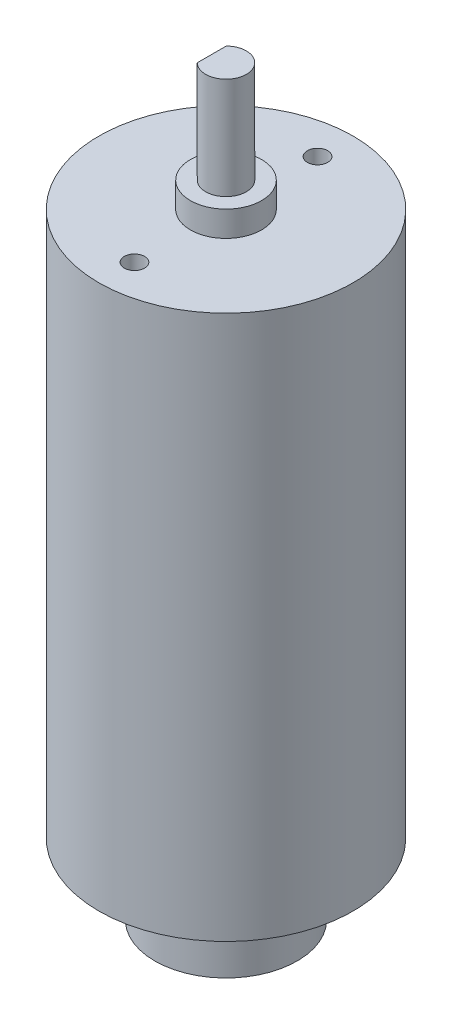
ISO-10303-21;
HEADER;
FILE_DESCRIPTION(('STEP AP214'),'2;1');
FILE_NAME('part.step','',(''),(''),'','','');
FILE_SCHEMA(('AUTOMOTIVE_DESIGN { 1 0 10303 214 1 1 1 1 }'));
ENDSEC;
DATA;
#1=APPLICATION_CONTEXT('core data for automotive mechanical design processes');
#2=APPLICATION_PROTOCOL_DEFINITION('international standard','automotive_design',2000,#1);
#3=PRODUCT_CONTEXT('',#1,'mechanical');
#4=PRODUCT('Part','Part','',(#3));
#5=PRODUCT_RELATED_PRODUCT_CATEGORY('part','',(#4));
#6=PRODUCT_DEFINITION_FORMATION('','',#4);
#7=PRODUCT_DEFINITION_CONTEXT('part definition',#1,'design');
#8=PRODUCT_DEFINITION('design','',#6,#7);
#9=PRODUCT_DEFINITION_SHAPE('','',#8);
#10=(LENGTH_UNIT() NAMED_UNIT(*) SI_UNIT(.MILLI.,.METRE.));
#11=(NAMED_UNIT(*) PLANE_ANGLE_UNIT() SI_UNIT($,.RADIAN.));
#12=(NAMED_UNIT(*) SI_UNIT($,.STERADIAN.) SOLID_ANGLE_UNIT());
#13=UNCERTAINTY_MEASURE_WITH_UNIT(LENGTH_MEASURE(1.E-05),#10,'distance_accuracy_value','');
#14=(GEOMETRIC_REPRESENTATION_CONTEXT(3) GLOBAL_UNCERTAINTY_ASSIGNED_CONTEXT((#13)) GLOBAL_UNIT_ASSIGNED_CONTEXT((#10,
#11,#12)) REPRESENTATION_CONTEXT('',''));
#15=CARTESIAN_POINT('',(0.,0.,0.));
#16=DIRECTION('',(0.,0.,1.));
#17=DIRECTION('',(1.,0.,0.));
#18=AXIS2_PLACEMENT_3D('',#15,#16,#17);
#19=CARTESIAN_POINT('',(0.,63.,0.));
#20=DIRECTION('',(0.,1.,0.));
#21=DIRECTION('',(0.,0.,1.));
#22=AXIS2_PLACEMENT_3D('',#19,#20,#21);
#23=PLANE('',#22);
#24=CARTESIAN_POINT('',(0.,63.,0.));
#25=DIRECTION('',(0.,1.,0.));
#26=DIRECTION('',(0.,0.,1.));
#27=AXIS2_PLACEMENT_3D('',#24,#25,#26);
#28=CIRCLE('',#27,3.5);
#29=CARTESIAN_POINT('',(0.,63.,3.5));
#30=VERTEX_POINT('',#29);
#31=EDGE_CURVE('E101',#30,#30,#28,.T.);
#32=ORIENTED_EDGE('',*,*,#31,.T.);
#33=EDGE_LOOP('',(#32));
#34=FACE_BOUND('',#33,.T.);
#35=CARTESIAN_POINT('',(0.,63.,0.));
#36=DIRECTION('',(0.,1.,0.));
#37=DIRECTION('',(0.,0.,1.));
#38=AXIS2_PLACEMENT_3D('',#35,#36,#37);
#39=CIRCLE('',#38,2.);
#40=CARTESIAN_POINT('',(0.,63.,2.));
#41=VERTEX_POINT('',#40);
#42=EDGE_CURVE('E89',#41,#41,#39,.T.);
#43=ORIENTED_EDGE('',*,*,#42,.F.);
#44=EDGE_LOOP('',(#43));
#45=FACE_BOUND('',#44,.T.);
#46=ADVANCED_FACE('F35',(#34,#45),#23,.T.);
#47=CARTESIAN_POINT('',(0.,7.,0.));
#48=DIRECTION('',(0.,-1.,0.));
#49=DIRECTION('',(0.,0.,-1.));
#50=AXIS2_PLACEMENT_3D('',#47,#48,#49);
#51=CYLINDRICAL_SURFACE('',#50,7.);
#52=CARTESIAN_POINT('',(0.,7.,0.));
#53=DIRECTION('',(0.,1.,0.));
#54=DIRECTION('',(0.,0.,1.));
#55=AXIS2_PLACEMENT_3D('',#52,#53,#54);
#56=CIRCLE('',#55,7.);
#57=CARTESIAN_POINT('',(0.,7.,7.));
#58=VERTEX_POINT('',#57);
#59=EDGE_CURVE('E107',#58,#58,#56,.T.);
#60=ORIENTED_EDGE('',*,*,#59,.F.);
#61=EDGE_LOOP('',(#60));
#62=FACE_BOUND('',#61,.T.);
#63=CARTESIAN_POINT('',(0.,0.,0.));
#64=DIRECTION('',(0.,1.,0.));
#65=DIRECTION('',(0.,0.,1.));
#66=AXIS2_PLACEMENT_3D('',#63,#64,#65);
#67=CIRCLE('',#66,7.);
#68=CARTESIAN_POINT('',(0.,0.,7.));
#69=VERTEX_POINT('',#68);
#70=EDGE_CURVE('E111',#69,#69,#67,.T.);
#71=ORIENTED_EDGE('',*,*,#70,.T.);
#72=EDGE_LOOP('',(#71));
#73=FACE_BOUND('',#72,.T.);
#74=ADVANCED_FACE('F37',(#62,#73),#51,.T.);
#75=CARTESIAN_POINT('',(0.,0.,0.));
#76=DIRECTION('',(0.,1.,0.));
#77=DIRECTION('',(0.,0.,1.));
#78=AXIS2_PLACEMENT_3D('',#75,#76,#77);
#79=PLANE('',#78);
#80=ORIENTED_EDGE('',*,*,#70,.F.);
#81=EDGE_LOOP('',(#80));
#82=FACE_BOUND('',#81,.T.);
#83=ADVANCED_FACE('F119',(#82),#79,.F.);
#84=CARTESIAN_POINT('',(0.,60.5,0.));
#85=DIRECTION('',(0.,-1.,0.));
#86=DIRECTION('',(0.,0.,-1.));
#87=AXIS2_PLACEMENT_3D('',#84,#85,#86);
#88=CYLINDRICAL_SURFACE('',#87,12.5);
#89=CARTESIAN_POINT('',(0.,60.5,0.));
#90=DIRECTION('',(0.,1.,0.));
#91=DIRECTION('',(0.,0.,1.));
#92=AXIS2_PLACEMENT_3D('',#89,#90,#91);
#93=CIRCLE('',#92,12.5);
#94=CARTESIAN_POINT('',(0.,60.5,-12.5));
#95=VERTEX_POINT('',#94);
#96=EDGE_CURVE('E108',#95,#95,#93,.T.);
#97=CARTESIAN_POINT('',(0.,7.,0.));
#98=DIRECTION('',(0.,1.,0.));
#99=DIRECTION('',(0.,0.,1.));
#100=AXIS2_PLACEMENT_3D('',#97,#98,#99);
#101=CIRCLE('',#100,12.5);
#102=CARTESIAN_POINT('',(0.,7.00000000000001,-12.5));
#103=VERTEX_POINT('',#102);
#104=EDGE_CURVE('E104',#103,#103,#101,.T.);
#105=CARTESIAN_POINT('',(0.,60.5,-12.5));
#106=CARTESIAN_POINT('',(0.,59.9427083333333,-12.5));
#107=CARTESIAN_POINT('',(0.,59.3854166666667,-12.5));
#108=CARTESIAN_POINT('',(0.,58.2708333333333,-12.5));
#109=CARTESIAN_POINT('',(0.,57.7135416666667,-12.5));
#110=CARTESIAN_POINT('',(0.,56.5989583333333,-12.5));
#111=CARTESIAN_POINT('',(0.,56.0416666666667,-12.5));
#112=CARTESIAN_POINT('',(0.,54.9270833333333,-12.5));
#113=CARTESIAN_POINT('',(0.,54.3697916666667,-12.5));
#114=CARTESIAN_POINT('',(0.,53.2552083333333,-12.5));
#115=CARTESIAN_POINT('',(0.,52.6979166666667,-12.5));
#116=CARTESIAN_POINT('',(0.,51.5833333333333,-12.5));
#117=CARTESIAN_POINT('',(0.,51.0260416666667,-12.5));
#118=CARTESIAN_POINT('',(0.,49.9114583333333,-12.5));
#119=CARTESIAN_POINT('',(0.,49.3541666666667,-12.5));
#120=CARTESIAN_POINT('',(0.,48.2395833333333,-12.5));
#121=CARTESIAN_POINT('',(0.,47.6822916666667,-12.5));
#122=CARTESIAN_POINT('',(0.,46.5677083333333,-12.5));
#123=CARTESIAN_POINT('',(0.,46.0104166666667,-12.5));
#124=CARTESIAN_POINT('',(0.,44.8958333333333,-12.5));
#125=CARTESIAN_POINT('',(0.,44.3385416666667,-12.5));
#126=CARTESIAN_POINT('',(0.,43.2239583333333,-12.5));
#127=CARTESIAN_POINT('',(0.,42.6666666666667,-12.5));
#128=CARTESIAN_POINT('',(0.,41.5520833333333,-12.5));
#129=CARTESIAN_POINT('',(0.,40.9947916666667,-12.5));
#130=CARTESIAN_POINT('',(0.,39.8802083333333,-12.5));
#131=CARTESIAN_POINT('',(0.,39.3229166666667,-12.5));
#132=CARTESIAN_POINT('',(0.,38.2083333333333,-12.5));
#133=CARTESIAN_POINT('',(0.,37.6510416666667,-12.5));
#134=CARTESIAN_POINT('',(0.,36.5364583333333,-12.5));
#135=CARTESIAN_POINT('',(0.,35.9791666666667,-12.5));
#136=CARTESIAN_POINT('',(0.,34.8645833333333,-12.5));
#137=CARTESIAN_POINT('',(0.,34.3072916666667,-12.5));
#138=CARTESIAN_POINT('',(0.,33.1927083333333,-12.5));
#139=CARTESIAN_POINT('',(0.,32.6354166666667,-12.5));
#140=CARTESIAN_POINT('',(0.,31.5208333333333,-12.5));
#141=CARTESIAN_POINT('',(0.,30.9635416666667,-12.5));
#142=CARTESIAN_POINT('',(0.,29.8489583333333,-12.5));
#143=CARTESIAN_POINT('',(0.,29.2916666666667,-12.5));
#144=CARTESIAN_POINT('',(0.,28.1770833333333,-12.5));
#145=CARTESIAN_POINT('',(0.,27.6197916666667,-12.5));
#146=CARTESIAN_POINT('',(0.,26.5052083333333,-12.5));
#147=CARTESIAN_POINT('',(0.,25.9479166666667,-12.5));
#148=CARTESIAN_POINT('',(0.,24.8333333333333,-12.5));
#149=CARTESIAN_POINT('',(0.,24.2760416666667,-12.5));
#150=CARTESIAN_POINT('',(0.,23.1614583333333,-12.5));
#151=CARTESIAN_POINT('',(0.,22.6041666666667,-12.5));
#152=CARTESIAN_POINT('',(0.,21.4895833333333,-12.5));
#153=CARTESIAN_POINT('',(0.,20.9322916666667,-12.5));
#154=CARTESIAN_POINT('',(0.,19.8177083333333,-12.5));
#155=CARTESIAN_POINT('',(0.,19.2604166666667,-12.5));
#156=CARTESIAN_POINT('',(0.,18.1458333333333,-12.5));
#157=CARTESIAN_POINT('',(0.,17.5885416666667,-12.5));
#158=CARTESIAN_POINT('',(0.,16.4739583333333,-12.5));
#159=CARTESIAN_POINT('',(0.,15.9166666666667,-12.5));
#160=CARTESIAN_POINT('',(0.,14.8020833333333,-12.5));
#161=CARTESIAN_POINT('',(0.,14.2447916666667,-12.5));
#162=CARTESIAN_POINT('',(0.,13.1302083333333,-12.5));
#163=CARTESIAN_POINT('',(0.,12.5729166666667,-12.5));
#164=CARTESIAN_POINT('',(0.,11.4583333333333,-12.5));
#165=CARTESIAN_POINT('',(0.,10.9010416666667,-12.5));
#166=CARTESIAN_POINT('',(0.,9.78645833333334,-12.5));
#167=CARTESIAN_POINT('',(0.,9.22916666666667,-12.5));
#168=CARTESIAN_POINT('',(0.,8.11458333333334,-12.5));
#169=CARTESIAN_POINT('',(0.,7.55729166666667,-12.5));
#170=CARTESIAN_POINT('',(0.,7.00000000000001,-12.5));
#171=B_SPLINE_CURVE_WITH_KNOTS('',3,(#105,#106,#107,#108,#109,#110,#111,#112,#113,#114,#115,
#116,#117,#118,#119,#120,#121,#122,#123,#124,#125,#126,#127,#128,#129,#130,#131,#132,#133,#134,
#135,#136,#137,#138,#139,#140,#141,#142,#143,#144,#145,#146,#147,#148,#149,#150,#151,#152,#153,
#154,#155,#156,#157,#158,#159,#160,#161,#162,#163,#164,#165,#166,#167,#168,#169,#170),
.UNSPECIFIED.,.F.,.F.,(4,2,2,2,2,2,2,2,2,2,2,2,2,2,2,2,2,2,2,2,2,2,2,2,2,2,2,2,2,2,2,2,4),(0.,
1.671875,3.34375000000001,5.015625,6.68750000000001,8.359375,10.03125,11.703125,13.375,
15.046875,16.71875,18.390625,20.0625,21.734375,23.40625,25.078125,26.75,28.421875,30.09375,
31.765625,33.4375,35.109375,36.78125,38.453125,40.125,41.796875,43.46875,45.140625,46.8125,
48.484375,50.15625,51.828125,53.5),.UNSPECIFIED.);
#172=EDGE_CURVE('BSEAM121',#95,#103,#171,.T.);
#173=ORIENTED_EDGE('',*,*,#96,.F.);
#174=ORIENTED_EDGE('',*,*,#104,.T.);
#175=ORIENTED_EDGE('',*,*,#172,.T.);
#176=ORIENTED_EDGE('',*,*,#172,.F.);
#177=EDGE_LOOP('',(#173,#175,#174,#176));
#178=FACE_BOUND('',#177,.T.);
#179=ADVANCED_FACE('F121',(#178),#88,.T.);
#180=CARTESIAN_POINT('',(0.,60.5,0.));
#181=DIRECTION('',(0.,1.,0.));
#182=DIRECTION('',(0.,0.,1.));
#183=AXIS2_PLACEMENT_3D('',#180,#181,#182);
#184=PLANE('',#183);
#185=CARTESIAN_POINT('',(0.,60.5,9.));
#186=DIRECTION('',(0.,1.,0.));
#187=DIRECTION('',(0.,0.,1.));
#188=AXIS2_PLACEMENT_3D('',#185,#186,#187);
#189=CIRCLE('',#188,1.);
#190=CARTESIAN_POINT('',(0.,60.5,10.));
#191=VERTEX_POINT('',#190);
#192=EDGE_CURVE('E78',#191,#191,#189,.T.);
#193=ORIENTED_EDGE('',*,*,#192,.F.);
#194=EDGE_LOOP('',(#193));
#195=FACE_BOUND('',#194,.T.);
#196=CARTESIAN_POINT('',(0.,60.5,-9.));
#197=DIRECTION('',(0.,1.,0.));
#198=DIRECTION('',(0.,0.,1.));
#199=AXIS2_PLACEMENT_3D('',#196,#197,#198);
#200=CIRCLE('',#199,1.);
#201=CARTESIAN_POINT('',(0.,60.5,-8.));
#202=VERTEX_POINT('',#201);
#203=EDGE_CURVE('E77',#202,#202,#200,.T.);
#204=ORIENTED_EDGE('',*,*,#203,.F.);
#205=EDGE_LOOP('',(#204));
#206=FACE_BOUND('',#205,.T.);
#207=CARTESIAN_POINT('',(0.,60.5,0.));
#208=DIRECTION('',(0.,1.,0.));
#209=DIRECTION('',(0.,0.,1.));
#210=AXIS2_PLACEMENT_3D('',#207,#208,#209);
#211=CIRCLE('',#210,3.5);
#212=CARTESIAN_POINT('',(0.,60.5,3.5));
#213=VERTEX_POINT('',#212);
#214=EDGE_CURVE('E43',#213,#213,#211,.T.);
#215=ORIENTED_EDGE('',*,*,#214,.F.);
#216=EDGE_LOOP('',(#215));
#217=FACE_BOUND('',#216,.T.);
#218=ORIENTED_EDGE('',*,*,#96,.T.);
#219=EDGE_LOOP('',(#218));
#220=FACE_BOUND('',#219,.T.);
#221=ADVANCED_FACE('F126',(#195,#206,#217,#220),#184,.T.);
#222=CARTESIAN_POINT('',(0.,7.,0.));
#223=DIRECTION('',(0.,1.,0.));
#224=DIRECTION('',(0.,0.,1.));
#225=AXIS2_PLACEMENT_3D('',#222,#223,#224);
#226=PLANE('',#225);
#227=ORIENTED_EDGE('',*,*,#59,.T.);
#228=EDGE_LOOP('',(#227));
#229=FACE_BOUND('',#228,.T.);
#230=ORIENTED_EDGE('',*,*,#104,.F.);
#231=EDGE_LOOP('',(#230));
#232=FACE_BOUND('',#231,.T.);
#233=ADVANCED_FACE('F143',(#229,#232),#226,.F.);
#234=CARTESIAN_POINT('',(0.,63.,0.));
#235=DIRECTION('',(0.,-1.,0.));
#236=DIRECTION('',(0.,0.,-1.));
#237=AXIS2_PLACEMENT_3D('',#234,#235,#236);
#238=CYLINDRICAL_SURFACE('',#237,3.5);
#239=ORIENTED_EDGE('',*,*,#31,.F.);
#240=EDGE_LOOP('',(#239));
#241=FACE_BOUND('',#240,.T.);
#242=ORIENTED_EDGE('',*,*,#214,.T.);
#243=EDGE_LOOP('',(#242));
#244=FACE_BOUND('',#243,.T.);
#245=ADVANCED_FACE('F140',(#241,#244),#238,.T.);
#246=CARTESIAN_POINT('',(0.,73.,0.));
#247=DIRECTION('',(0.,-1.,0.));
#248=DIRECTION('',(0.,0.,-1.));
#249=AXIS2_PLACEMENT_3D('',#246,#247,#248);
#250=CYLINDRICAL_SURFACE('',#249,2.);
#251=DIRECTION('',(0.,-1.,0.));
#252=VECTOR('',#251,1.);
#253=CARTESIAN_POINT('',(-1.4,73.,1.42828568570857));
#254=LINE('',#253,#252);
#255=CARTESIAN_POINT('',(-1.4,73.,1.42828568570857));
#256=VERTEX_POINT('',#255);
#257=CARTESIAN_POINT('',(-1.4,65.,1.42828568570857));
#258=VERTEX_POINT('',#257);
#259=EDGE_CURVE('E93',#256,#258,#254,.T.);
#260=ORIENTED_EDGE('',*,*,#259,.T.);
#261=CARTESIAN_POINT('',(0.,65.,0.));
#262=DIRECTION('',(0.,1.,0.));
#263=DIRECTION('',(0.,0.,1.));
#264=AXIS2_PLACEMENT_3D('',#261,#262,#263);
#265=CIRCLE('',#264,2.);
#266=CARTESIAN_POINT('',(-1.4,65.,-1.42828568570857));
#267=VERTEX_POINT('',#266);
#268=EDGE_CURVE('E49',#267,#258,#265,.T.);
#269=ORIENTED_EDGE('',*,*,#268,.F.);
#270=DIRECTION('',(0.,-1.,0.));
#271=VECTOR('',#270,1.);
#272=CARTESIAN_POINT('',(-1.4,73.,-1.42828568570857));
#273=LINE('',#272,#271);
#274=CARTESIAN_POINT('',(-1.4,73.,-1.42828568570857));
#275=VERTEX_POINT('',#274);
#276=EDGE_CURVE('E98',#275,#267,#273,.T.);
#277=ORIENTED_EDGE('',*,*,#276,.F.);
#278=CARTESIAN_POINT('',(0.,73.,0.));
#279=DIRECTION('',(0.,1.,0.));
#280=DIRECTION('',(0.,0.,1.));
#281=AXIS2_PLACEMENT_3D('',#278,#279,#280);
#282=CIRCLE('',#281,2.);
#283=EDGE_CURVE('E90',#256,#275,#282,.T.);
#284=ORIENTED_EDGE('',*,*,#283,.F.);
#285=EDGE_LOOP('',(#260,#269,#277,#284));
#286=FACE_BOUND('',#285,.T.);
#287=ORIENTED_EDGE('',*,*,#42,.T.);
#288=EDGE_LOOP('',(#287));
#289=FACE_BOUND('',#288,.T.);
#290=ADVANCED_FACE('F138',(#286,#289),#250,.T.);
#291=CARTESIAN_POINT('',(-1.4,73.,1.42828568570857));
#292=DIRECTION('',(1.,0.,0.));
#293=DIRECTION('',(0.,0.,-1.));
#294=AXIS2_PLACEMENT_3D('',#291,#292,#293);
#295=PLANE('',#294);
#296=ORIENTED_EDGE('',*,*,#276,.T.);
#297=DIRECTION('',(0.,0.,1.));
#298=VECTOR('',#297,1.);
#299=CARTESIAN_POINT('',(-1.4,65.,1.42828568570857));
#300=LINE('',#299,#298);
#301=EDGE_CURVE('E11',#267,#258,#300,.T.);
#302=ORIENTED_EDGE('',*,*,#301,.T.);
#303=ORIENTED_EDGE('',*,*,#259,.F.);
#304=DIRECTION('',(0.,0.,1.));
#305=VECTOR('',#304,1.);
#306=CARTESIAN_POINT('',(-1.4,73.,1.42828568570857));
#307=LINE('',#306,#305);
#308=EDGE_CURVE('E55',#275,#256,#307,.T.);
#309=ORIENTED_EDGE('',*,*,#308,.F.);
#310=EDGE_LOOP('',(#296,#302,#303,#309));
#311=FACE_BOUND('',#310,.T.);
#312=ADVANCED_FACE('F170',(#311),#295,.F.);
#313=CARTESIAN_POINT('',(0.,73.,0.));
#314=DIRECTION('',(0.,1.,0.));
#315=DIRECTION('',(0.,0.,1.));
#316=AXIS2_PLACEMENT_3D('',#313,#314,#315);
#317=PLANE('',#316);
#318=ORIENTED_EDGE('',*,*,#283,.T.);
#319=ORIENTED_EDGE('',*,*,#308,.T.);
#320=EDGE_LOOP('',(#318,#319));
#321=FACE_BOUND('',#320,.T.);
#322=ADVANCED_FACE('F177',(#321),#317,.T.);
#323=CARTESIAN_POINT('',(0.,65.,0.));
#324=DIRECTION('',(0.,1.,0.));
#325=DIRECTION('',(0.,0.,1.));
#326=AXIS2_PLACEMENT_3D('',#323,#324,#325);
#327=PLANE('',#326);
#328=ORIENTED_EDGE('',*,*,#301,.F.);
#329=ORIENTED_EDGE('',*,*,#268,.T.);
#330=EDGE_LOOP('',(#328,#329));
#331=FACE_BOUND('',#330,.T.);
#332=ADVANCED_FACE('F184',(#331),#327,.T.);
#333=CARTESIAN_POINT('',(0.,50.5,-9.));
#334=DIRECTION('',(0.,1.,0.));
#335=DIRECTION('',(0.,0.,1.));
#336=AXIS2_PLACEMENT_3D('',#333,#334,#335);
#337=CONICAL_SURFACE('',#336,0.999999999999999,1.02974425867665);
#338=CARTESIAN_POINT('',(0.,49.8991393809724,-9.));
#339=VERTEX_POINT('',#338);
#340=VERTEX_LOOP('',#339);
#341=FACE_BOUND('',#340,.T.);
#342=CARTESIAN_POINT('',(0.,50.5,-9.));
#343=DIRECTION('',(0.,1.,0.));
#344=DIRECTION('',(0.,0.,1.));
#345=AXIS2_PLACEMENT_3D('',#342,#343,#344);
#346=CIRCLE('',#345,0.999999999999999);
#347=CARTESIAN_POINT('',(0.,50.5,-8.));
#348=VERTEX_POINT('',#347);
#349=EDGE_CURVE('E81',#348,#348,#346,.T.);
#350=ORIENTED_EDGE('',*,*,#349,.T.);
#351=EDGE_LOOP('',(#350));
#352=FACE_BOUND('',#351,.T.);
#353=ADVANCED_FACE('F190',(#341,#352),#337,.F.);
#354=CARTESIAN_POINT('',(0.,60.5,-9.));
#355=DIRECTION('',(0.,1.,0.));
#356=DIRECTION('',(0.,0.,1.));
#357=AXIS2_PLACEMENT_3D('',#354,#355,#356);
#358=CYLINDRICAL_SURFACE('',#357,1.);
#359=ORIENTED_EDGE('',*,*,#349,.F.);
#360=EDGE_LOOP('',(#359));
#361=FACE_BOUND('',#360,.T.);
#362=ORIENTED_EDGE('',*,*,#203,.T.);
#363=EDGE_LOOP('',(#362));
#364=FACE_BOUND('',#363,.T.);
#365=ADVANCED_FACE('F71',(#361,#364),#358,.F.);
#366=CARTESIAN_POINT('',(0.,50.5,9.));
#367=DIRECTION('',(0.,1.,0.));
#368=DIRECTION('',(0.,0.,1.));
#369=AXIS2_PLACEMENT_3D('',#366,#367,#368);
#370=CONICAL_SURFACE('',#369,0.999999999999999,1.02974425867665);
#371=CARTESIAN_POINT('',(0.,49.8991393809724,9.));
#372=VERTEX_POINT('',#371);
#373=VERTEX_LOOP('',#372);
#374=FACE_BOUND('',#373,.T.);
#375=CARTESIAN_POINT('',(0.,50.5,9.));
#376=DIRECTION('',(0.,1.,0.));
#377=DIRECTION('',(0.,0.,1.));
#378=AXIS2_PLACEMENT_3D('',#375,#376,#377);
#379=CIRCLE('',#378,0.999999999999999);
#380=CARTESIAN_POINT('',(0.,50.5,10.));
#381=VERTEX_POINT('',#380);
#382=EDGE_CURVE('E75',#381,#381,#379,.T.);
#383=ORIENTED_EDGE('',*,*,#382,.T.);
#384=EDGE_LOOP('',(#383));
#385=FACE_BOUND('',#384,.T.);
#386=ADVANCED_FACE('F67',(#374,#385),#370,.F.);
#387=CARTESIAN_POINT('',(0.,60.5,9.));
#388=DIRECTION('',(0.,1.,0.));
#389=DIRECTION('',(0.,0.,1.));
#390=AXIS2_PLACEMENT_3D('',#387,#388,#389);
#391=CYLINDRICAL_SURFACE('',#390,1.);
#392=ORIENTED_EDGE('',*,*,#382,.F.);
#393=EDGE_LOOP('',(#392));
#394=FACE_BOUND('',#393,.T.);
#395=ORIENTED_EDGE('',*,*,#192,.T.);
#396=EDGE_LOOP('',(#395));
#397=FACE_BOUND('',#396,.T.);
#398=ADVANCED_FACE('F70',(#394,#397),#391,.F.);
#399=CLOSED_SHELL('',(#46,#74,#83,#179,#221,#233,#245,#290,#312,#322,#332,#353,#365,#386,#398));
#400=MANIFOLD_SOLID_BREP('B2',#399);
#401=ADVANCED_BREP_SHAPE_REPRESENTATION('',(#18,#400),#14);
#402=SHAPE_DEFINITION_REPRESENTATION(#9,#401);
ENDSEC;
END-ISO-10303-21;
